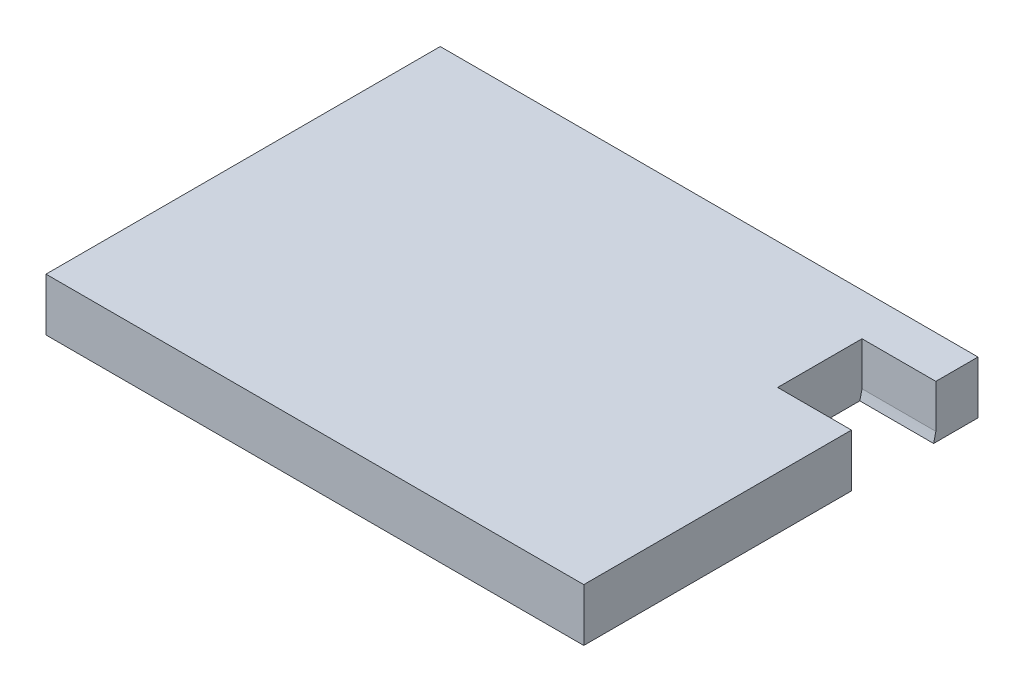
ISO-10303-21;
HEADER;
FILE_DESCRIPTION(('STEP AP214'),'2;1');
FILE_NAME('part.step','',(''),(''),'','','');
FILE_SCHEMA(('AUTOMOTIVE_DESIGN { 1 0 10303 214 1 1 1 1 }'));
ENDSEC;
DATA;
#1=APPLICATION_CONTEXT('core data for automotive mechanical design processes');
#2=APPLICATION_PROTOCOL_DEFINITION('international standard','automotive_design',2000,#1);
#3=PRODUCT_CONTEXT('',#1,'mechanical');
#4=PRODUCT('Part','Part','',(#3));
#5=PRODUCT_RELATED_PRODUCT_CATEGORY('part','',(#4));
#6=PRODUCT_DEFINITION_FORMATION('','',#4);
#7=PRODUCT_DEFINITION_CONTEXT('part definition',#1,'design');
#8=PRODUCT_DEFINITION('design','',#6,#7);
#9=PRODUCT_DEFINITION_SHAPE('','',#8);
#10=(LENGTH_UNIT() NAMED_UNIT(*) SI_UNIT(.MILLI.,.METRE.));
#11=(NAMED_UNIT(*) PLANE_ANGLE_UNIT() SI_UNIT($,.RADIAN.));
#12=(NAMED_UNIT(*) SI_UNIT($,.STERADIAN.) SOLID_ANGLE_UNIT());
#13=UNCERTAINTY_MEASURE_WITH_UNIT(LENGTH_MEASURE(1.E-05),#10,'distance_accuracy_value','');
#14=(GEOMETRIC_REPRESENTATION_CONTEXT(3) GLOBAL_UNCERTAINTY_ASSIGNED_CONTEXT((#13)) GLOBAL_UNIT_ASSIGNED_CONTEXT((#10,
#11,#12)) REPRESENTATION_CONTEXT('',''));
#15=CARTESIAN_POINT('',(0.,0.,0.));
#16=DIRECTION('',(0.,0.,1.));
#17=DIRECTION('',(1.,0.,0.));
#18=AXIS2_PLACEMENT_3D('',#15,#16,#17);
#19=CARTESIAN_POINT('',(8.5,0.,0.));
#20=DIRECTION('',(-1.,0.,0.));
#21=DIRECTION('',(0.,0.,1.));
#22=AXIS2_PLACEMENT_3D('',#19,#20,#21);
#23=PLANE('',#22);
#24=DIRECTION('',(0.,0.,1.));
#25=VECTOR('',#24,1.);
#26=CARTESIAN_POINT('',(8.5,-23.5,-45.));
#27=LINE('',#26,#25);
#28=CARTESIAN_POINT('',(8.5,-23.5,-33.));
#29=VERTEX_POINT('',#28);
#30=CARTESIAN_POINT('',(8.5,-23.5,-7.61333347303129));
#31=VERTEX_POINT('',#30);
#32=EDGE_CURVE('E142',#29,#31,#27,.T.);
#33=ORIENTED_EDGE('',*,*,#32,.T.);
#34=DIRECTION('',(0.,-1.,0.));
#35=VECTOR('',#34,1.);
#36=CARTESIAN_POINT('',(8.5,0.,-7.61333347303129));
#37=LINE('',#36,#35);
#38=CARTESIAN_POINT('',(8.5,-28.5,-7.61333347303129));
#39=VERTEX_POINT('',#38);
#40=EDGE_CURVE('E37',#31,#39,#37,.T.);
#41=ORIENTED_EDGE('',*,*,#40,.T.);
#42=DIRECTION('',(0.,0.,-1.));
#43=VECTOR('',#42,1.);
#44=CARTESIAN_POINT('',(8.5,-28.5,0.));
#45=LINE('',#44,#43);
#46=CARTESIAN_POINT('',(8.5,-28.5,-33.));
#47=VERTEX_POINT('',#46);
#48=EDGE_CURVE('E136',#39,#47,#45,.T.);
#49=ORIENTED_EDGE('',*,*,#48,.T.);
#50=DIRECTION('',(0.,1.,0.));
#51=VECTOR('',#50,1.);
#52=CARTESIAN_POINT('',(8.5,-28.5,-33.));
#53=LINE('',#52,#51);
#54=EDGE_CURVE('E111',#47,#29,#53,.T.);
#55=ORIENTED_EDGE('',*,*,#54,.T.);
#56=EDGE_LOOP('',(#33,#41,#49,#55));
#57=FACE_BOUND('',#56,.T.);
#58=ADVANCED_FACE('F33',(#57),#23,.F.);
#59=CARTESIAN_POINT('',(8.5,-28.5,-40.7921561087423));
#60=VERTEX_POINT('',#59);
#61=CARTESIAN_POINT('',(8.5,-28.5,-45.));
#62=VERTEX_POINT('',#61);
#63=EDGE_CURVE('E135',#60,#62,#45,.T.);
#64=ORIENTED_EDGE('',*,*,#63,.T.);
#65=DIRECTION('',(0.,1.,0.));
#66=VECTOR('',#65,1.);
#67=CARTESIAN_POINT('',(8.5,-23.5,-45.));
#68=LINE('',#67,#66);
#69=CARTESIAN_POINT('',(8.5,-23.5,-45.));
#70=VERTEX_POINT('',#69);
#71=EDGE_CURVE('E143',#62,#70,#68,.T.);
#72=ORIENTED_EDGE('',*,*,#71,.T.);
#73=CARTESIAN_POINT('',(8.5,-23.5,-41.));
#74=VERTEX_POINT('',#73);
#75=EDGE_CURVE('E116',#70,#74,#27,.T.);
#76=ORIENTED_EDGE('',*,*,#75,.T.);
#77=DIRECTION('',(0.,1.,0.));
#78=VECTOR('',#77,1.);
#79=CARTESIAN_POINT('',(8.5,-28.5,-41.));
#80=LINE('',#79,#78);
#81=CARTESIAN_POINT('',(8.5,-27.6104335791443,-41.));
#82=VERTEX_POINT('',#81);
#83=EDGE_CURVE('E113',#82,#74,#80,.T.);
#84=ORIENTED_EDGE('',*,*,#83,.F.);
#85=CARTESIAN_POINT('',(8.5,-18.5,0.));
#86=DIRECTION('',(-1.,0.,0.));
#87=DIRECTION('',(0.,0.,1.));
#88=AXIS2_PLACEMENT_3D('',#85,#86,#87);
#89=CIRCLE('',#88,42.);
#90=EDGE_CURVE('E103',#82,#60,#89,.T.);
#91=ORIENTED_EDGE('',*,*,#90,.T.);
#92=EDGE_LOOP('',(#64,#72,#76,#84,#91));
#93=FACE_BOUND('',#92,.T.);
#94=ADVANCED_FACE('F114',(#93),#23,.F.);
#95=CARTESIAN_POINT('',(0.,0.,-7.61333347303129));
#96=DIRECTION('',(0.,0.,1.));
#97=DIRECTION('',(1.,0.,0.));
#98=AXIS2_PLACEMENT_3D('',#95,#96,#97);
#99=PLANE('',#98);
#100=ORIENTED_EDGE('',*,*,#40,.F.);
#101=DIRECTION('',(1.,0.,0.));
#102=VECTOR('',#101,1.);
#103=CARTESIAN_POINT('',(0.,-23.5,-7.61333347303129));
#104=LINE('',#103,#102);
#105=CARTESIAN_POINT('',(-42.5,-23.5,-7.61333347303129));
#106=VERTEX_POINT('',#105);
#107=EDGE_CURVE('E161',#106,#31,#104,.T.);
#108=ORIENTED_EDGE('',*,*,#107,.F.);
#109=DIRECTION('',(0.,1.,0.));
#110=VECTOR('',#109,1.);
#111=CARTESIAN_POINT('',(-42.5,-18.5,-7.61333347303129));
#112=LINE('',#111,#110);
#113=CARTESIAN_POINT('',(-42.5,-28.5,-7.61333347303129));
#114=VERTEX_POINT('',#113);
#115=EDGE_CURVE('E171',#114,#106,#112,.T.);
#116=ORIENTED_EDGE('',*,*,#115,.F.);
#117=DIRECTION('',(1.,0.,0.));
#118=VECTOR('',#117,1.);
#119=CARTESIAN_POINT('',(0.,-28.5,-7.61333347303129));
#120=LINE('',#119,#118);
#121=EDGE_CURVE('E178',#114,#39,#120,.T.);
#122=ORIENTED_EDGE('',*,*,#121,.T.);
#123=EDGE_LOOP('',(#100,#108,#116,#122));
#124=FACE_BOUND('',#123,.T.);
#125=ADVANCED_FACE('F186',(#124),#99,.T.);
#126=CARTESIAN_POINT('',(57.5,-18.5,0.));
#127=DIRECTION('',(-1.,0.,0.));
#128=DIRECTION('',(0.,0.,1.));
#129=AXIS2_PLACEMENT_3D('',#126,#127,#128);
#130=CYLINDRICAL_SURFACE('',#129,42.);
#131=CARTESIAN_POINT('',(1.5,-18.5,0.));
#132=DIRECTION('',(-1.,0.,0.));
#133=DIRECTION('',(0.,0.,1.));
#134=AXIS2_PLACEMENT_3D('',#131,#132,#133);
#135=CIRCLE('',#134,42.);
#136=CARTESIAN_POINT('',(1.5,-27.6104335791443,-41.));
#137=VERTEX_POINT('',#136);
#138=CARTESIAN_POINT('',(1.5,-28.5,-40.7921561087423));
#139=VERTEX_POINT('',#138);
#140=EDGE_CURVE('E125',#137,#139,#135,.T.);
#141=ORIENTED_EDGE('',*,*,#140,.T.);
#142=DIRECTION('',(-1.,0.,0.));
#143=VECTOR('',#142,1.);
#144=CARTESIAN_POINT('',(57.5,-28.5,-40.7921561087423));
#145=LINE('',#144,#143);
#146=EDGE_CURVE('E42',#139,#60,#145,.F.);
#147=ORIENTED_EDGE('',*,*,#146,.T.);
#148=ORIENTED_EDGE('',*,*,#90,.F.);
#149=DIRECTION('',(-1.,0.,0.));
#150=VECTOR('',#149,1.);
#151=CARTESIAN_POINT('',(57.5,-27.6104335791443,-41.));
#152=LINE('',#151,#150);
#153=EDGE_CURVE('E107',#137,#82,#152,.F.);
#154=ORIENTED_EDGE('',*,*,#153,.F.);
#155=EDGE_LOOP('',(#141,#147,#148,#154));
#156=FACE_BOUND('',#155,.T.);
#157=ADVANCED_FACE('F105',(#156),#130,.F.);
#158=CARTESIAN_POINT('',(0.,-28.5,-41.));
#159=DIRECTION('',(0.,0.,1.));
#160=DIRECTION('',(1.,0.,0.));
#161=AXIS2_PLACEMENT_3D('',#158,#159,#160);
#162=PLANE('',#161);
#163=DIRECTION('',(0.,1.,0.));
#164=VECTOR('',#163,1.);
#165=CARTESIAN_POINT('',(1.5,-28.5,-41.));
#166=LINE('',#165,#164);
#167=CARTESIAN_POINT('',(1.5,-23.5,-41.));
#168=VERTEX_POINT('',#167);
#169=EDGE_CURVE('E120',#137,#168,#166,.T.);
#170=ORIENTED_EDGE('',*,*,#169,.F.);
#171=ORIENTED_EDGE('',*,*,#153,.T.);
#172=ORIENTED_EDGE('',*,*,#83,.T.);
#173=DIRECTION('',(1.,0.,0.));
#174=VECTOR('',#173,1.);
#175=CARTESIAN_POINT('',(0.,-23.5,-41.));
#176=LINE('',#175,#174);
#177=EDGE_CURVE('E166',#168,#74,#176,.T.);
#178=ORIENTED_EDGE('',*,*,#177,.F.);
#179=EDGE_LOOP('',(#170,#171,#172,#178));
#180=FACE_BOUND('',#179,.T.);
#181=ADVANCED_FACE('F124',(#180),#162,.T.);
#182=CARTESIAN_POINT('',(1.5,-28.5,0.));
#183=DIRECTION('',(-1.,0.,0.));
#184=DIRECTION('',(0.,0.,1.));
#185=AXIS2_PLACEMENT_3D('',#182,#183,#184);
#186=PLANE('',#185);
#187=ORIENTED_EDGE('',*,*,#140,.F.);
#188=ORIENTED_EDGE('',*,*,#169,.T.);
#189=DIRECTION('',(0.,0.,1.));
#190=VECTOR('',#189,1.);
#191=CARTESIAN_POINT('',(1.5,-23.5,0.));
#192=LINE('',#191,#190);
#193=CARTESIAN_POINT('',(1.5,-23.5,-33.));
#194=VERTEX_POINT('',#193);
#195=EDGE_CURVE('E167',#168,#194,#192,.T.);
#196=ORIENTED_EDGE('',*,*,#195,.T.);
#197=DIRECTION('',(0.,1.,0.));
#198=VECTOR('',#197,1.);
#199=CARTESIAN_POINT('',(1.5,-28.5,-33.));
#200=LINE('',#199,#198);
#201=CARTESIAN_POINT('',(1.5,-28.5,-33.));
#202=VERTEX_POINT('',#201);
#203=EDGE_CURVE('E121',#202,#194,#200,.T.);
#204=ORIENTED_EDGE('',*,*,#203,.F.);
#205=DIRECTION('',(0.,0.,1.));
#206=VECTOR('',#205,1.);
#207=CARTESIAN_POINT('',(1.5,-28.5,0.));
#208=LINE('',#207,#206);
#209=EDGE_CURVE('E169',#139,#202,#208,.T.);
#210=ORIENTED_EDGE('',*,*,#209,.F.);
#211=EDGE_LOOP('',(#187,#188,#196,#204,#210));
#212=FACE_BOUND('',#211,.T.);
#213=ADVANCED_FACE('F193',(#212),#186,.F.);
#214=CARTESIAN_POINT('',(57.5,-23.5,-45.));
#215=DIRECTION('',(0.,0.,-1.));
#216=DIRECTION('',(-1.,0.,0.));
#217=AXIS2_PLACEMENT_3D('',#214,#215,#216);
#218=PLANE('',#217);
#219=ORIENTED_EDGE('',*,*,#71,.F.);
#220=DIRECTION('',(-1.,0.,0.));
#221=VECTOR('',#220,1.);
#222=CARTESIAN_POINT('',(57.5,-28.5,-45.));
#223=LINE('',#222,#221);
#224=CARTESIAN_POINT('',(-42.5,-28.5,-45.));
#225=VERTEX_POINT('',#224);
#226=EDGE_CURVE('E11',#62,#225,#223,.T.);
#227=ORIENTED_EDGE('',*,*,#226,.T.);
#228=DIRECTION('',(0.,-1.,0.));
#229=VECTOR('',#228,1.);
#230=CARTESIAN_POINT('',(-42.5,-23.5,-45.));
#231=LINE('',#230,#229);
#232=CARTESIAN_POINT('',(-42.5,-23.5,-45.));
#233=VERTEX_POINT('',#232);
#234=EDGE_CURVE('E129',#233,#225,#231,.T.);
#235=ORIENTED_EDGE('',*,*,#234,.F.);
#236=DIRECTION('',(-1.,0.,0.));
#237=VECTOR('',#236,1.);
#238=CARTESIAN_POINT('',(57.5,-23.5,-45.));
#239=LINE('',#238,#237);
#240=EDGE_CURVE('E126',#70,#233,#239,.T.);
#241=ORIENTED_EDGE('',*,*,#240,.F.);
#242=EDGE_LOOP('',(#219,#227,#235,#241));
#243=FACE_BOUND('',#242,.T.);
#244=ADVANCED_FACE('F195',(#243),#218,.T.);
#245=CARTESIAN_POINT('',(57.5,-23.5,-45.));
#246=DIRECTION('',(0.,1.,0.));
#247=DIRECTION('',(0.,0.,1.));
#248=AXIS2_PLACEMENT_3D('',#245,#246,#247);
#249=PLANE('',#248);
#250=ORIENTED_EDGE('',*,*,#75,.F.);
#251=ORIENTED_EDGE('',*,*,#240,.T.);
#252=DIRECTION('',(0.,0.,-1.));
#253=VECTOR('',#252,1.);
#254=CARTESIAN_POINT('',(-42.5,-23.5,-45.));
#255=LINE('',#254,#253);
#256=EDGE_CURVE('E138',#106,#233,#255,.T.);
#257=ORIENTED_EDGE('',*,*,#256,.F.);
#258=ORIENTED_EDGE('',*,*,#107,.T.);
#259=ORIENTED_EDGE('',*,*,#32,.F.);
#260=DIRECTION('',(1.,0.,0.));
#261=VECTOR('',#260,1.);
#262=CARTESIAN_POINT('',(0.,-23.5,-33.));
#263=LINE('',#262,#261);
#264=EDGE_CURVE('E159',#194,#29,#263,.T.);
#265=ORIENTED_EDGE('',*,*,#264,.F.);
#266=ORIENTED_EDGE('',*,*,#195,.F.);
#267=ORIENTED_EDGE('',*,*,#177,.T.);
#268=EDGE_LOOP('',(#250,#251,#257,#258,#259,#265,#266,#267));
#269=FACE_BOUND('',#268,.T.);
#270=ADVANCED_FACE('F157',(#269),#249,.T.);
#271=CARTESIAN_POINT('',(0.,-28.5,0.));
#272=DIRECTION('',(0.,-1.,0.));
#273=DIRECTION('',(0.,0.,-1.));
#274=AXIS2_PLACEMENT_3D('',#271,#272,#273);
#275=PLANE('',#274);
#276=ORIENTED_EDGE('',*,*,#48,.F.);
#277=ORIENTED_EDGE('',*,*,#121,.F.);
#278=DIRECTION('',(0.,0.,1.));
#279=VECTOR('',#278,1.);
#280=CARTESIAN_POINT('',(-42.5,-28.5,-45.));
#281=LINE('',#280,#279);
#282=EDGE_CURVE('E132',#225,#114,#281,.T.);
#283=ORIENTED_EDGE('',*,*,#282,.F.);
#284=ORIENTED_EDGE('',*,*,#226,.F.);
#285=ORIENTED_EDGE('',*,*,#63,.F.);
#286=ORIENTED_EDGE('',*,*,#146,.F.);
#287=ORIENTED_EDGE('',*,*,#209,.T.);
#288=DIRECTION('',(1.,0.,0.));
#289=VECTOR('',#288,1.);
#290=CARTESIAN_POINT('',(0.,-28.5,-33.));
#291=LINE('',#290,#289);
#292=EDGE_CURVE('E177',#202,#47,#291,.T.);
#293=ORIENTED_EDGE('',*,*,#292,.T.);
#294=EDGE_LOOP('',(#276,#277,#283,#284,#285,#286,#287,#293));
#295=FACE_BOUND('',#294,.T.);
#296=ADVANCED_FACE('F185',(#295),#275,.T.);
#297=CARTESIAN_POINT('',(-42.5,-18.5,0.));
#298=DIRECTION('',(-1.,0.,0.));
#299=DIRECTION('',(0.,0.,1.));
#300=AXIS2_PLACEMENT_3D('',#297,#298,#299);
#301=PLANE('',#300);
#302=ORIENTED_EDGE('',*,*,#282,.T.);
#303=ORIENTED_EDGE('',*,*,#115,.T.);
#304=ORIENTED_EDGE('',*,*,#256,.T.);
#305=ORIENTED_EDGE('',*,*,#234,.T.);
#306=EDGE_LOOP('',(#302,#303,#304,#305));
#307=FACE_BOUND('',#306,.T.);
#308=ADVANCED_FACE('F35',(#307),#301,.T.);
#309=CARTESIAN_POINT('',(0.,-28.5,-33.));
#310=DIRECTION('',(0.,0.,1.));
#311=DIRECTION('',(1.,0.,0.));
#312=AXIS2_PLACEMENT_3D('',#309,#310,#311);
#313=PLANE('',#312);
#314=ORIENTED_EDGE('',*,*,#264,.T.);
#315=ORIENTED_EDGE('',*,*,#54,.F.);
#316=ORIENTED_EDGE('',*,*,#292,.F.);
#317=ORIENTED_EDGE('',*,*,#203,.T.);
#318=EDGE_LOOP('',(#314,#315,#316,#317));
#319=FACE_BOUND('',#318,.T.);
#320=ADVANCED_FACE('F164',(#319),#313,.F.);
#321=CLOSED_SHELL('',(#58,#94,#125,#157,#181,#213,#244,#270,#296,#308,#320));
#322=MANIFOLD_SOLID_BREP('B2',#321);
#323=ADVANCED_BREP_SHAPE_REPRESENTATION('',(#18,#322),#14);
#324=SHAPE_DEFINITION_REPRESENTATION(#9,#323);
ENDSEC;
END-ISO-10303-21;
